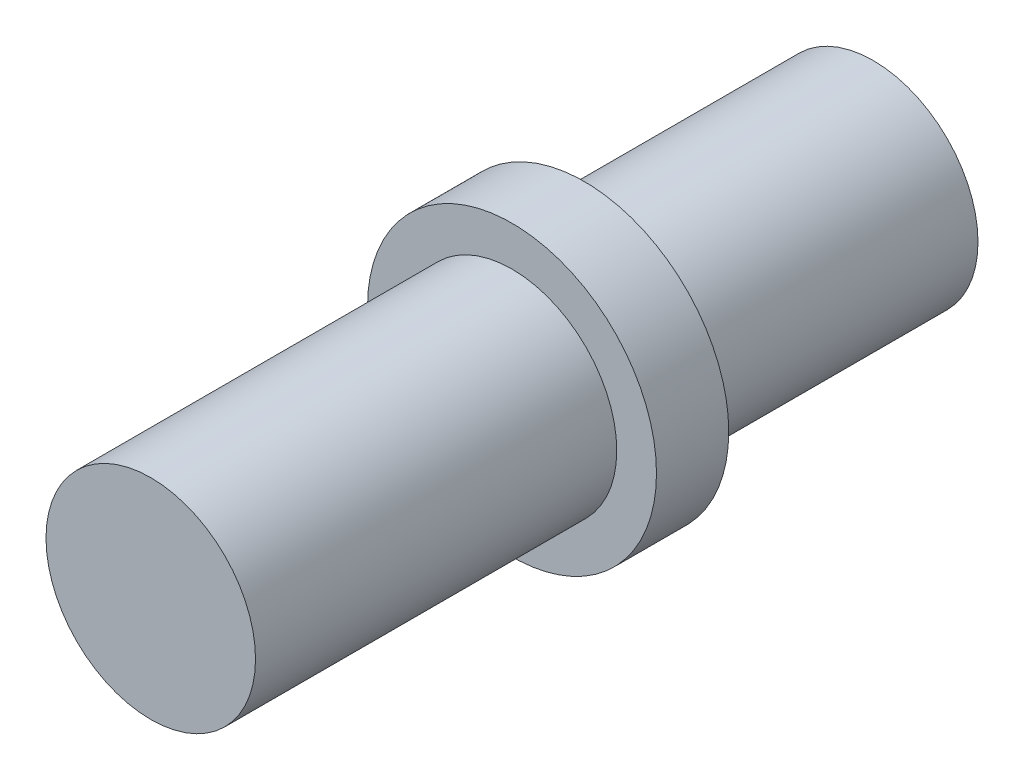
ISO-10303-21;
HEADER;
FILE_DESCRIPTION(('STEP AP214'),'2;1');
FILE_NAME('part.step','',(''),(''),'','','');
FILE_SCHEMA(('AUTOMOTIVE_DESIGN { 1 0 10303 214 1 1 1 1 }'));
ENDSEC;
DATA;
#1=APPLICATION_CONTEXT('core data for automotive mechanical design processes');
#2=APPLICATION_PROTOCOL_DEFINITION('international standard','automotive_design',2000,#1);
#3=PRODUCT_CONTEXT('',#1,'mechanical');
#4=PRODUCT('Part','Part','',(#3));
#5=PRODUCT_RELATED_PRODUCT_CATEGORY('part','',(#4));
#6=PRODUCT_DEFINITION_FORMATION('','',#4);
#7=PRODUCT_DEFINITION_CONTEXT('part definition',#1,'design');
#8=PRODUCT_DEFINITION('design','',#6,#7);
#9=PRODUCT_DEFINITION_SHAPE('','',#8);
#10=(LENGTH_UNIT() NAMED_UNIT(*) SI_UNIT(.MILLI.,.METRE.));
#11=(NAMED_UNIT(*) PLANE_ANGLE_UNIT() SI_UNIT($,.RADIAN.));
#12=(NAMED_UNIT(*) SI_UNIT($,.STERADIAN.) SOLID_ANGLE_UNIT());
#13=UNCERTAINTY_MEASURE_WITH_UNIT(LENGTH_MEASURE(1.E-05),#10,'distance_accuracy_value','');
#14=(GEOMETRIC_REPRESENTATION_CONTEXT(3) GLOBAL_UNCERTAINTY_ASSIGNED_CONTEXT((#13)) GLOBAL_UNIT_ASSIGNED_CONTEXT((#10,
#11,#12)) REPRESENTATION_CONTEXT('',''));
#15=CARTESIAN_POINT('',(0.,0.,0.));
#16=DIRECTION('',(0.,0.,1.));
#17=DIRECTION('',(1.,0.,0.));
#18=AXIS2_PLACEMENT_3D('',#15,#16,#17);
#19=CARTESIAN_POINT('',(0.,0.,20.));
#20=DIRECTION('',(0.,0.,-1.));
#21=DIRECTION('',(-1.,0.,0.));
#22=AXIS2_PLACEMENT_3D('',#19,#20,#21);
#23=CYLINDRICAL_SURFACE('',#22,2.9);
#24=CARTESIAN_POINT('',(0.,0.,10.));
#25=DIRECTION('',(0.,0.,1.));
#26=DIRECTION('',(1.,0.,0.));
#27=AXIS2_PLACEMENT_3D('',#24,#25,#26);
#28=CIRCLE('',#27,2.9);
#29=CARTESIAN_POINT('',(2.9,0.,10.));
#30=VERTEX_POINT('',#29);
#31=EDGE_CURVE('E40',#30,#30,#28,.T.);
#32=ORIENTED_EDGE('',*,*,#31,.T.);
#33=EDGE_LOOP('',(#32));
#34=FACE_BOUND('',#33,.T.);
#35=CARTESIAN_POINT('',(0.,0.,20.));
#36=DIRECTION('',(0.,0.,1.));
#37=DIRECTION('',(1.,0.,0.));
#38=AXIS2_PLACEMENT_3D('',#35,#36,#37);
#39=CIRCLE('',#38,2.9);
#40=CARTESIAN_POINT('',(2.9,0.,20.));
#41=VERTEX_POINT('',#40);
#42=EDGE_CURVE('E44',#41,#41,#39,.T.);
#43=ORIENTED_EDGE('',*,*,#42,.F.);
#44=EDGE_LOOP('',(#43));
#45=FACE_BOUND('',#44,.T.);
#46=ADVANCED_FACE('F37',(#34,#45),#23,.T.);
#47=CARTESIAN_POINT('',(0.,0.,20.));
#48=DIRECTION('',(0.,0.,1.));
#49=DIRECTION('',(1.,0.,0.));
#50=AXIS2_PLACEMENT_3D('',#47,#48,#49);
#51=PLANE('',#50);
#52=ORIENTED_EDGE('',*,*,#42,.T.);
#53=EDGE_LOOP('',(#52));
#54=FACE_BOUND('',#53,.T.);
#55=ADVANCED_FACE('F76',(#54),#51,.T.);
#56=CARTESIAN_POINT('',(0.,0.,10.));
#57=DIRECTION('',(0.,0.,-1.));
#58=DIRECTION('',(-1.,0.,0.));
#59=AXIS2_PLACEMENT_3D('',#56,#57,#58);
#60=CYLINDRICAL_SURFACE('',#59,4.);
#61=CARTESIAN_POINT('',(0.,0.,10.));
#62=DIRECTION('',(0.,0.,1.));
#63=DIRECTION('',(1.,0.,0.));
#64=AXIS2_PLACEMENT_3D('',#61,#62,#63);
#65=CIRCLE('',#64,4.);
#66=CARTESIAN_POINT('',(4.,0.,10.));
#67=VERTEX_POINT('',#66);
#68=EDGE_CURVE('E56',#67,#67,#65,.T.);
#69=ORIENTED_EDGE('',*,*,#68,.F.);
#70=EDGE_LOOP('',(#69));
#71=FACE_BOUND('',#70,.T.);
#72=CARTESIAN_POINT('',(0.,0.,8.));
#73=DIRECTION('',(0.,0.,1.));
#74=DIRECTION('',(1.,0.,0.));
#75=AXIS2_PLACEMENT_3D('',#72,#73,#74);
#76=CIRCLE('',#75,4.);
#77=CARTESIAN_POINT('',(4.,0.,8.));
#78=VERTEX_POINT('',#77);
#79=EDGE_CURVE('E53',#78,#78,#76,.T.);
#80=ORIENTED_EDGE('',*,*,#79,.T.);
#81=EDGE_LOOP('',(#80));
#82=FACE_BOUND('',#81,.T.);
#83=ADVANCED_FACE('F68',(#71,#82),#60,.T.);
#84=CARTESIAN_POINT('',(0.,0.,10.));
#85=DIRECTION('',(0.,0.,1.));
#86=DIRECTION('',(1.,0.,0.));
#87=AXIS2_PLACEMENT_3D('',#84,#85,#86);
#88=PLANE('',#87);
#89=ORIENTED_EDGE('',*,*,#31,.F.);
#90=EDGE_LOOP('',(#89));
#91=FACE_BOUND('',#90,.T.);
#92=ORIENTED_EDGE('',*,*,#68,.T.);
#93=EDGE_LOOP('',(#92));
#94=FACE_BOUND('',#93,.T.);
#95=ADVANCED_FACE('F65',(#91,#94),#88,.T.);
#96=CARTESIAN_POINT('',(0.,0.,8.));
#97=DIRECTION('',(0.,0.,1.));
#98=DIRECTION('',(1.,0.,0.));
#99=AXIS2_PLACEMENT_3D('',#96,#97,#98);
#100=PLANE('',#99);
#101=CARTESIAN_POINT('',(0.,0.,8.));
#102=DIRECTION('',(0.,0.,1.));
#103=DIRECTION('',(1.,0.,0.));
#104=AXIS2_PLACEMENT_3D('',#101,#102,#103);
#105=CIRCLE('',#104,2.9);
#106=CARTESIAN_POINT('',(2.9,0.,8.));
#107=VERTEX_POINT('',#106);
#108=EDGE_CURVE('E10',#107,#107,#105,.T.);
#109=ORIENTED_EDGE('',*,*,#108,.T.);
#110=EDGE_LOOP('',(#109));
#111=FACE_BOUND('',#110,.T.);
#112=ORIENTED_EDGE('',*,*,#79,.F.);
#113=EDGE_LOOP('',(#112));
#114=FACE_BOUND('',#113,.T.);
#115=ADVANCED_FACE('F67',(#111,#114),#100,.F.);
#116=CARTESIAN_POINT('',(0.,0.,0.));
#117=DIRECTION('',(0.,0.,1.));
#118=DIRECTION('',(1.,0.,0.));
#119=AXIS2_PLACEMENT_3D('',#116,#117,#118);
#120=PLANE('',#119);
#121=CARTESIAN_POINT('',(0.,0.,0.));
#122=DIRECTION('',(0.,0.,1.));
#123=DIRECTION('',(1.,0.,0.));
#124=AXIS2_PLACEMENT_3D('',#121,#122,#123);
#125=CIRCLE('',#124,2.9);
#126=CARTESIAN_POINT('',(2.9,0.,0.));
#127=VERTEX_POINT('',#126);
#128=EDGE_CURVE('E48',#127,#127,#125,.T.);
#129=ORIENTED_EDGE('',*,*,#128,.F.);
#130=EDGE_LOOP('',(#129));
#131=FACE_BOUND('',#130,.T.);
#132=ADVANCED_FACE('F74',(#131),#120,.F.);
#133=ORIENTED_EDGE('',*,*,#128,.T.);
#134=EDGE_LOOP('',(#133));
#135=FACE_BOUND('',#134,.T.);
#136=ORIENTED_EDGE('',*,*,#108,.F.);
#137=EDGE_LOOP('',(#136));
#138=FACE_BOUND('',#137,.T.);
#139=ADVANCED_FACE('F80',(#135,#138),#23,.T.);
#140=CLOSED_SHELL('',(#46,#55,#83,#95,#115,#132,#139));
#141=MANIFOLD_SOLID_BREP('B2',#140);
#142=ADVANCED_BREP_SHAPE_REPRESENTATION('',(#18,#141),#14);
#143=SHAPE_DEFINITION_REPRESENTATION(#9,#142);
ENDSEC;
END-ISO-10303-21;
